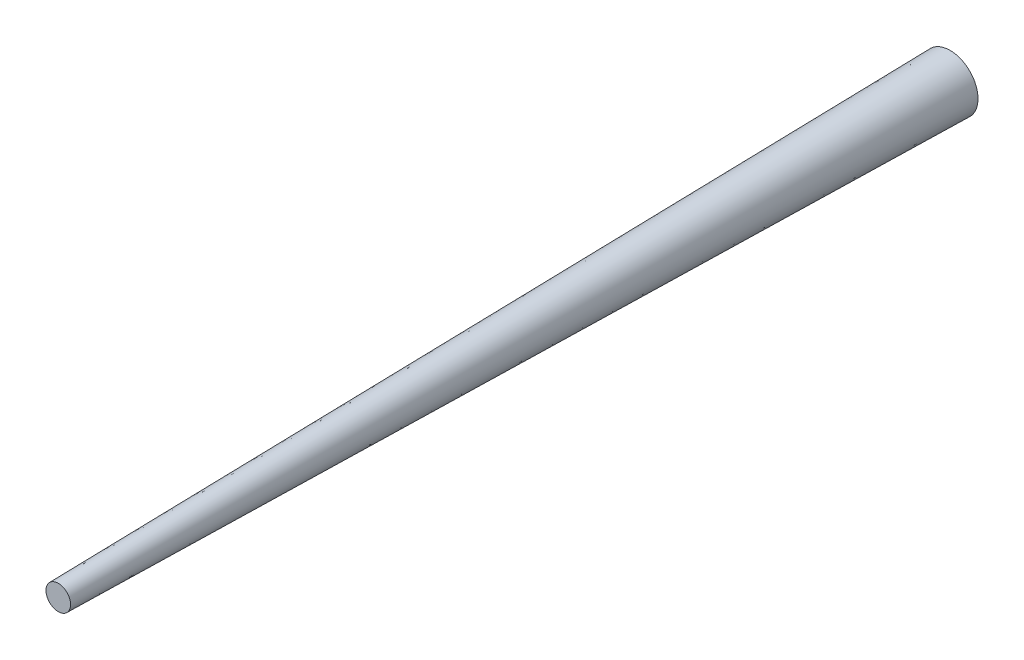
ISO-10303-21;
HEADER;
FILE_DESCRIPTION(('STEP AP214'),'2;1');
FILE_NAME('part.step','',(''),(''),'','','');
FILE_SCHEMA(('AUTOMOTIVE_DESIGN { 1 0 10303 214 1 1 1 1 }'));
ENDSEC;
DATA;
#1=APPLICATION_CONTEXT('core data for automotive mechanical design processes');
#2=APPLICATION_PROTOCOL_DEFINITION('international standard','automotive_design',2000,#1);
#3=PRODUCT_CONTEXT('',#1,'mechanical');
#4=PRODUCT('Part','Part','',(#3));
#5=PRODUCT_RELATED_PRODUCT_CATEGORY('part','',(#4));
#6=PRODUCT_DEFINITION_FORMATION('','',#4);
#7=PRODUCT_DEFINITION_CONTEXT('part definition',#1,'design');
#8=PRODUCT_DEFINITION('design','',#6,#7);
#9=PRODUCT_DEFINITION_SHAPE('','',#8);
#10=(LENGTH_UNIT() NAMED_UNIT(*) SI_UNIT(.MILLI.,.METRE.));
#11=(NAMED_UNIT(*) PLANE_ANGLE_UNIT() SI_UNIT($,.RADIAN.));
#12=(NAMED_UNIT(*) SI_UNIT($,.STERADIAN.) SOLID_ANGLE_UNIT());
#13=UNCERTAINTY_MEASURE_WITH_UNIT(LENGTH_MEASURE(1.E-05),#10,'distance_accuracy_value','');
#14=(GEOMETRIC_REPRESENTATION_CONTEXT(3) GLOBAL_UNCERTAINTY_ASSIGNED_CONTEXT((#13)) GLOBAL_UNIT_ASSIGNED_CONTEXT((#10,
#11,#12)) REPRESENTATION_CONTEXT('',''));
#15=CARTESIAN_POINT('',(0.,0.,0.));
#16=DIRECTION('',(0.,0.,1.));
#17=DIRECTION('',(1.,0.,0.));
#18=AXIS2_PLACEMENT_3D('',#15,#16,#17);
#19=CARTESIAN_POINT('',(0.,0.,0.));
#20=DIRECTION('',(0.,0.,-1.));
#21=DIRECTION('',(1.,0.,0.));
#22=AXIS2_PLACEMENT_3D('',#19,#20,#21);
#23=CONICAL_SURFACE('',#22,5.,0.0174532925199439);
#24=CARTESIAN_POINT('',(0.,0.,160.));
#25=DIRECTION('',(0.,0.,1.));
#26=DIRECTION('',(1.,0.,0.));
#27=AXIS2_PLACEMENT_3D('',#24,#25,#26);
#28=CIRCLE('',#27,2.20718961148509);
#29=CARTESIAN_POINT('',(2.20718961148509,0.,160.));
#30=VERTEX_POINT('',#29);
#31=EDGE_CURVE('E10',#30,#30,#28,.T.);
#32=ORIENTED_EDGE('',*,*,#31,.F.);
#33=EDGE_LOOP('',(#32));
#34=FACE_BOUND('',#33,.T.);
#35=CARTESIAN_POINT('',(0.,0.,0.));
#36=DIRECTION('',(0.,0.,1.));
#37=DIRECTION('',(1.,0.,0.));
#38=AXIS2_PLACEMENT_3D('',#35,#36,#37);
#39=CIRCLE('',#38,5.);
#40=CARTESIAN_POINT('',(5.,0.,0.));
#41=VERTEX_POINT('',#40);
#42=EDGE_CURVE('E41',#41,#41,#39,.T.);
#43=ORIENTED_EDGE('',*,*,#42,.T.);
#44=EDGE_LOOP('',(#43));
#45=FACE_BOUND('',#44,.T.);
#46=ADVANCED_FACE('F35',(#34,#45),#23,.T.);
#47=CARTESIAN_POINT('',(0.,0.,160.));
#48=DIRECTION('',(0.,0.,1.));
#49=DIRECTION('',(1.,0.,0.));
#50=AXIS2_PLACEMENT_3D('',#47,#48,#49);
#51=PLANE('',#50);
#52=ORIENTED_EDGE('',*,*,#31,.T.);
#53=EDGE_LOOP('',(#52));
#54=FACE_BOUND('',#53,.T.);
#55=ADVANCED_FACE('F50',(#54),#51,.T.);
#56=CARTESIAN_POINT('',(0.,0.,0.));
#57=DIRECTION('',(0.,0.,1.));
#58=DIRECTION('',(1.,0.,0.));
#59=AXIS2_PLACEMENT_3D('',#56,#57,#58);
#60=PLANE('',#59);
#61=ORIENTED_EDGE('',*,*,#42,.F.);
#62=EDGE_LOOP('',(#61));
#63=FACE_BOUND('',#62,.T.);
#64=ADVANCED_FACE('F48',(#63),#60,.F.);
#65=CLOSED_SHELL('',(#46,#55,#64));
#66=MANIFOLD_SOLID_BREP('B2',#65);
#67=ADVANCED_BREP_SHAPE_REPRESENTATION('',(#18,#66),#14);
#68=SHAPE_DEFINITION_REPRESENTATION(#9,#67);
ENDSEC;
END-ISO-10303-21;
